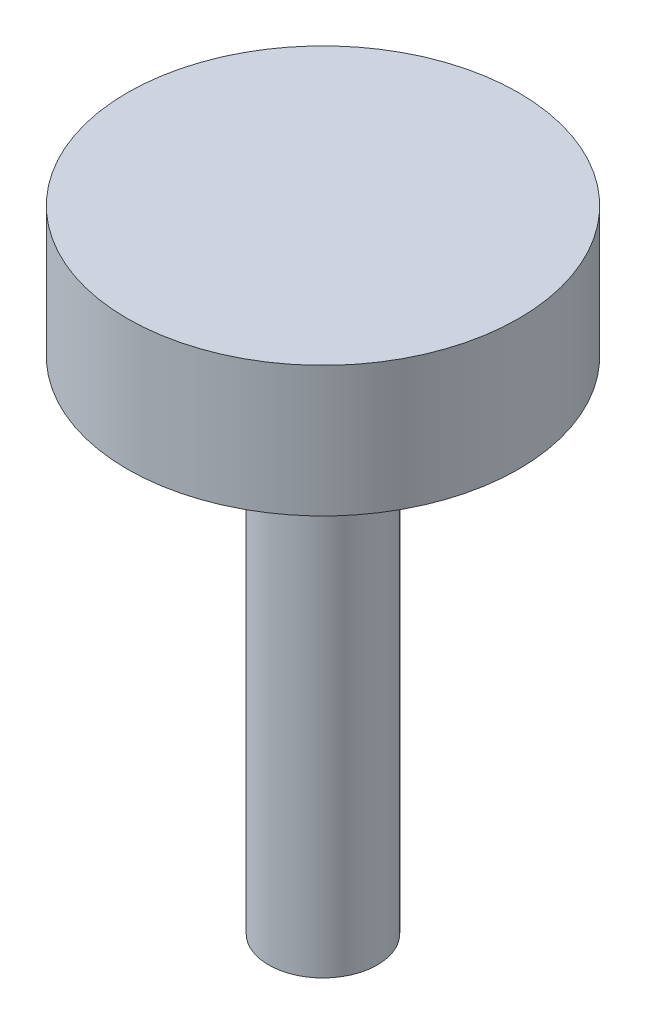
ISO-10303-21;
HEADER;
FILE_DESCRIPTION(('STEP AP214'),'2;1');
FILE_NAME('part.step','',(''),(''),'','','');
FILE_SCHEMA(('AUTOMOTIVE_DESIGN { 1 0 10303 214 1 1 1 1 }'));
ENDSEC;
DATA;
#1=APPLICATION_CONTEXT('core data for automotive mechanical design processes');
#2=APPLICATION_PROTOCOL_DEFINITION('international standard','automotive_design',2000,#1);
#3=PRODUCT_CONTEXT('',#1,'mechanical');
#4=PRODUCT('Part','Part','',(#3));
#5=PRODUCT_RELATED_PRODUCT_CATEGORY('part','',(#4));
#6=PRODUCT_DEFINITION_FORMATION('','',#4);
#7=PRODUCT_DEFINITION_CONTEXT('part definition',#1,'design');
#8=PRODUCT_DEFINITION('design','',#6,#7);
#9=PRODUCT_DEFINITION_SHAPE('','',#8);
#10=(LENGTH_UNIT() NAMED_UNIT(*) SI_UNIT(.MILLI.,.METRE.));
#11=(NAMED_UNIT(*) PLANE_ANGLE_UNIT() SI_UNIT($,.RADIAN.));
#12=(NAMED_UNIT(*) SI_UNIT($,.STERADIAN.) SOLID_ANGLE_UNIT());
#13=UNCERTAINTY_MEASURE_WITH_UNIT(LENGTH_MEASURE(1.E-05),#10,'distance_accuracy_value','');
#14=(GEOMETRIC_REPRESENTATION_CONTEXT(3) GLOBAL_UNCERTAINTY_ASSIGNED_CONTEXT((#13)) GLOBAL_UNIT_ASSIGNED_CONTEXT((#10,
#11,#12)) REPRESENTATION_CONTEXT('',''));
#15=CARTESIAN_POINT('',(0.,0.,0.));
#16=DIRECTION('',(0.,0.,1.));
#17=DIRECTION('',(1.,0.,0.));
#18=AXIS2_PLACEMENT_3D('',#15,#16,#17);
#19=CARTESIAN_POINT('',(0.,30.,0.));
#20=DIRECTION('',(0.,-1.,0.));
#21=DIRECTION('',(0.,0.,-1.));
#22=AXIS2_PLACEMENT_3D('',#19,#20,#21);
#23=CYLINDRICAL_SURFACE('',#22,45.);
#24=CARTESIAN_POINT('',(0.,30.,0.));
#25=DIRECTION('',(0.,1.,0.));
#26=DIRECTION('',(0.,0.,1.));
#27=AXIS2_PLACEMENT_3D('',#24,#25,#26);
#28=CIRCLE('',#27,45.);
#29=CARTESIAN_POINT('',(0.,30.,45.));
#30=VERTEX_POINT('',#29);
#31=EDGE_CURVE('E40',#30,#30,#28,.T.);
#32=ORIENTED_EDGE('',*,*,#31,.F.);
#33=EDGE_LOOP('',(#32));
#34=FACE_BOUND('',#33,.T.);
#35=CARTESIAN_POINT('',(0.,0.,0.));
#36=DIRECTION('',(0.,1.,0.));
#37=DIRECTION('',(0.,0.,1.));
#38=AXIS2_PLACEMENT_3D('',#35,#36,#37);
#39=CIRCLE('',#38,45.);
#40=CARTESIAN_POINT('',(0.,0.,45.));
#41=VERTEX_POINT('',#40);
#42=EDGE_CURVE('E36',#41,#41,#39,.T.);
#43=ORIENTED_EDGE('',*,*,#42,.T.);
#44=EDGE_LOOP('',(#43));
#45=FACE_BOUND('',#44,.T.);
#46=ADVANCED_FACE('F33',(#34,#45),#23,.T.);
#47=CARTESIAN_POINT('',(0.,30.,0.));
#48=DIRECTION('',(0.,1.,0.));
#49=DIRECTION('',(0.,0.,1.));
#50=AXIS2_PLACEMENT_3D('',#47,#48,#49);
#51=PLANE('',#50);
#52=ORIENTED_EDGE('',*,*,#31,.T.);
#53=EDGE_LOOP('',(#52));
#54=FACE_BOUND('',#53,.T.);
#55=ADVANCED_FACE('F57',(#54),#51,.T.);
#56=CARTESIAN_POINT('',(0.,0.,0.));
#57=DIRECTION('',(0.,1.,0.));
#58=DIRECTION('',(0.,0.,1.));
#59=AXIS2_PLACEMENT_3D('',#56,#57,#58);
#60=PLANE('',#59);
#61=CARTESIAN_POINT('',(0.,0.,0.));
#62=DIRECTION('',(0.,-1.,0.));
#63=DIRECTION('',(0.,0.,-1.));
#64=AXIS2_PLACEMENT_3D('',#61,#62,#63);
#65=CIRCLE('',#64,12.5);
#66=CARTESIAN_POINT('',(0.,0.,-12.5));
#67=VERTEX_POINT('',#66);
#68=EDGE_CURVE('E10',#67,#67,#65,.T.);
#69=ORIENTED_EDGE('',*,*,#68,.F.);
#70=EDGE_LOOP('',(#69));
#71=FACE_BOUND('',#70,.T.);
#72=ORIENTED_EDGE('',*,*,#42,.F.);
#73=EDGE_LOOP('',(#72));
#74=FACE_BOUND('',#73,.T.);
#75=ADVANCED_FACE('F54',(#71,#74),#60,.F.);
#76=CARTESIAN_POINT('',(0.,-115.,0.));
#77=DIRECTION('',(0.,1.,0.));
#78=DIRECTION('',(0.,0.,1.));
#79=AXIS2_PLACEMENT_3D('',#76,#77,#78);
#80=CYLINDRICAL_SURFACE('',#79,12.5);
#81=CARTESIAN_POINT('',(0.,-115.,0.));
#82=DIRECTION('',(0.,-1.,0.));
#83=DIRECTION('',(0.,0.,-1.));
#84=AXIS2_PLACEMENT_3D('',#81,#82,#83);
#85=CIRCLE('',#84,12.5);
#86=CARTESIAN_POINT('',(0.,-115.,-12.5));
#87=VERTEX_POINT('',#86);
#88=EDGE_CURVE('E46',#87,#87,#85,.T.);
#89=ORIENTED_EDGE('',*,*,#88,.F.);
#90=EDGE_LOOP('',(#89));
#91=FACE_BOUND('',#90,.T.);
#92=ORIENTED_EDGE('',*,*,#68,.T.);
#93=EDGE_LOOP('',(#92));
#94=FACE_BOUND('',#93,.T.);
#95=ADVANCED_FACE('F56',(#91,#94),#80,.T.);
#96=CARTESIAN_POINT('',(0.,-115.,0.));
#97=DIRECTION('',(0.,-1.,0.));
#98=DIRECTION('',(0.,0.,-1.));
#99=AXIS2_PLACEMENT_3D('',#96,#97,#98);
#100=PLANE('',#99);
#101=ORIENTED_EDGE('',*,*,#88,.T.);
#102=EDGE_LOOP('',(#101));
#103=FACE_BOUND('',#102,.T.);
#104=ADVANCED_FACE('F64',(#103),#100,.T.);
#105=CLOSED_SHELL('',(#46,#55,#75,#95,#104));
#106=MANIFOLD_SOLID_BREP('B2',#105);
#107=ADVANCED_BREP_SHAPE_REPRESENTATION('',(#18,#106),#14);
#108=SHAPE_DEFINITION_REPRESENTATION(#9,#107);
ENDSEC;
END-ISO-10303-21;
